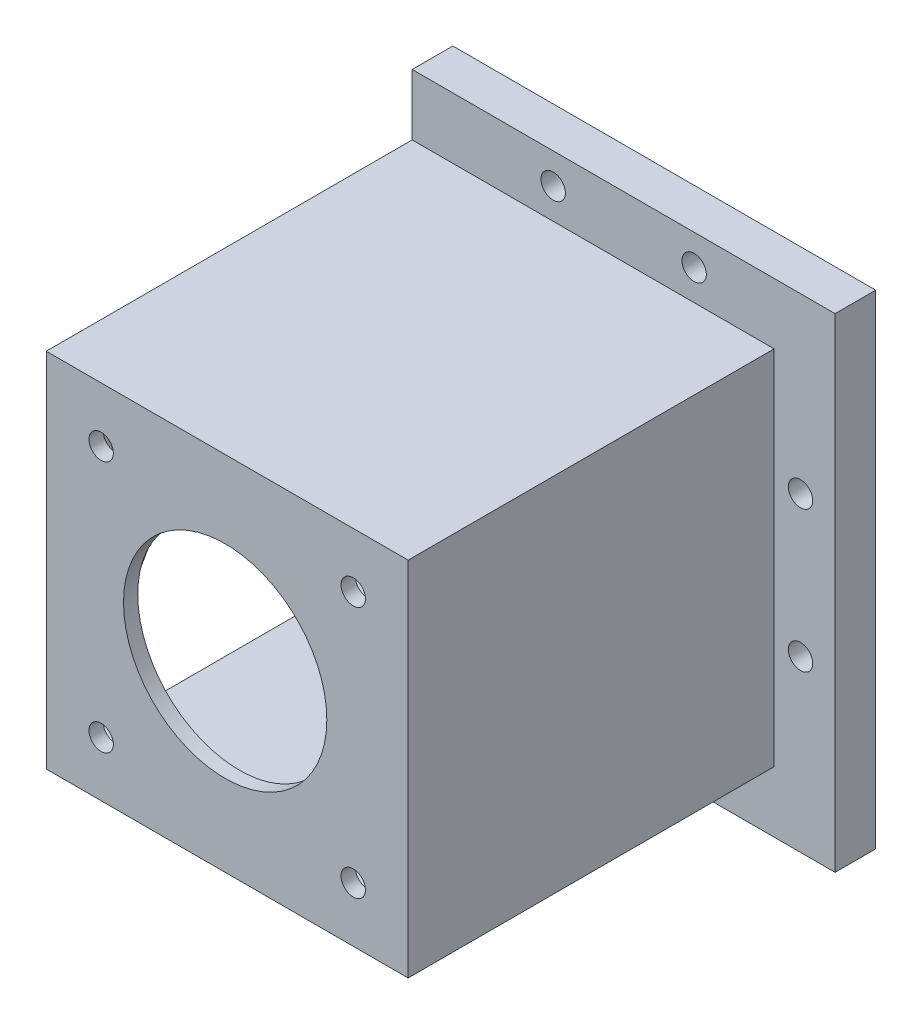
ISO-10303-21;
HEADER;
FILE_DESCRIPTION(('STEP AP214'),'2;1');
FILE_NAME('part.step','',(''),(''),'','','');
FILE_SCHEMA(('AUTOMOTIVE_DESIGN { 1 0 10303 214 1 1 1 1 }'));
ENDSEC;
DATA;
#1=APPLICATION_CONTEXT('core data for automotive mechanical design processes');
#2=APPLICATION_PROTOCOL_DEFINITION('international standard','automotive_design',2000,#1);
#3=PRODUCT_CONTEXT('',#1,'mechanical');
#4=PRODUCT('Part','Part','',(#3));
#5=PRODUCT_RELATED_PRODUCT_CATEGORY('part','',(#4));
#6=PRODUCT_DEFINITION_FORMATION('','',#4);
#7=PRODUCT_DEFINITION_CONTEXT('part definition',#1,'design');
#8=PRODUCT_DEFINITION('design','',#6,#7);
#9=PRODUCT_DEFINITION_SHAPE('','',#8);
#10=(LENGTH_UNIT() NAMED_UNIT(*) SI_UNIT(.MILLI.,.METRE.));
#11=(NAMED_UNIT(*) PLANE_ANGLE_UNIT() SI_UNIT($,.RADIAN.));
#12=(NAMED_UNIT(*) SI_UNIT($,.STERADIAN.) SOLID_ANGLE_UNIT());
#13=UNCERTAINTY_MEASURE_WITH_UNIT(LENGTH_MEASURE(1.E-05),#10,'distance_accuracy_value','');
#14=(GEOMETRIC_REPRESENTATION_CONTEXT(3) GLOBAL_UNCERTAINTY_ASSIGNED_CONTEXT((#13)) GLOBAL_UNIT_ASSIGNED_CONTEXT((#10,
#11,#12)) REPRESENTATION_CONTEXT('',''));
#15=CARTESIAN_POINT('',(0.,0.,0.));
#16=DIRECTION('',(0.,0.,1.));
#17=DIRECTION('',(1.,0.,0.));
#18=AXIS2_PLACEMENT_3D('',#15,#16,#17);
#19=CARTESIAN_POINT('',(-482.021213625064,0.,5.));
#20=DIRECTION('',(1.,0.,0.));
#21=DIRECTION('',(0.,0.,-1.));
#22=AXIS2_PLACEMENT_3D('',#19,#20,#21);
#23=PLANE('',#22);
#24=DIRECTION('',(0.,0.,-1.));
#25=VECTOR('',#24,1.);
#26=CARTESIAN_POINT('',(-482.021213625064,-181.581134846924,48.25));
#27=LINE('',#26,#25);
#28=CARTESIAN_POINT('',(-482.021213625064,-181.581134846924,24.125));
#29=VERTEX_POINT('',#28);
#30=CARTESIAN_POINT('',(-482.021213625064,-181.581134846924,0.));
#31=VERTEX_POINT('',#30);
#32=EDGE_CURVE('E55',#29,#31,#27,.T.);
#33=ORIENTED_EDGE('',*,*,#32,.F.);
#34=DIRECTION('',(0.,-0.869656237387225,0.493657805340395));
#35=VECTOR('',#34,1.);
#36=CARTESIAN_POINT('',(-482.021213625064,-181.581134846924,24.125));
#37=LINE('',#36,#35);
#38=CARTESIAN_POINT('',(-482.021213625064,-224.081134846924,48.25));
#39=VERTEX_POINT('',#38);
#40=EDGE_CURVE('E365',#29,#39,#37,.T.);
#41=ORIENTED_EDGE('',*,*,#40,.T.);
#42=DIRECTION('',(0.,0.,-1.));
#43=VECTOR('',#42,1.);
#44=CARTESIAN_POINT('',(-482.021213625064,-224.081134846924,48.25));
#45=LINE('',#44,#43);
#46=CARTESIAN_POINT('',(-482.021213625064,-224.081134846924,0.));
#47=VERTEX_POINT('',#46);
#48=EDGE_CURVE('E399',#39,#47,#45,.T.);
#49=ORIENTED_EDGE('',*,*,#48,.T.);
#50=DIRECTION('',(0.,-1.,0.));
#51=VECTOR('',#50,1.);
#52=CARTESIAN_POINT('',(-482.021213625064,0.,0.));
#53=LINE('',#52,#51);
#54=CARTESIAN_POINT('',(-482.021213625064,-232.581134846924,0.));
#55=VERTEX_POINT('',#54);
#56=EDGE_CURVE('E190',#47,#55,#53,.T.);
#57=ORIENTED_EDGE('',*,*,#56,.T.);
#58=DIRECTION('',(0.,0.,-1.));
#59=VECTOR('',#58,1.);
#60=CARTESIAN_POINT('',(-482.021213625064,-232.581134846924,5.));
#61=LINE('',#60,#59);
#62=CARTESIAN_POINT('',(-482.021213625064,-232.581134846924,5.));
#63=VERTEX_POINT('',#62);
#64=EDGE_CURVE('E11',#63,#55,#61,.T.);
#65=ORIENTED_EDGE('',*,*,#64,.F.);
#66=DIRECTION('',(0.,-1.,0.));
#67=VECTOR('',#66,1.);
#68=CARTESIAN_POINT('',(-482.021213625064,0.,5.));
#69=LINE('',#68,#67);
#70=CARTESIAN_POINT('',(-482.021213625064,-225.081134846924,5.));
#71=VERTEX_POINT('',#70);
#72=EDGE_CURVE('E64',#71,#63,#69,.T.);
#73=ORIENTED_EDGE('',*,*,#72,.F.);
#74=DIRECTION('',(0.,0.,-1.));
#75=VECTOR('',#74,1.);
#76=CARTESIAN_POINT('',(-482.021213625064,-225.081134846924,50.));
#77=LINE('',#76,#75);
#78=CARTESIAN_POINT('',(-482.021213625064,-225.081134846924,50.));
#79=VERTEX_POINT('',#78);
#80=EDGE_CURVE('E140',#79,#71,#77,.T.);
#81=ORIENTED_EDGE('',*,*,#80,.F.);
#82=DIRECTION('',(0.,1.,0.));
#83=VECTOR('',#82,1.);
#84=CARTESIAN_POINT('',(-482.021213625064,0.,50.));
#85=LINE('',#84,#83);
#86=CARTESIAN_POINT('',(-482.021213625064,-180.581134846924,50.));
#87=VERTEX_POINT('',#86);
#88=EDGE_CURVE('E435',#79,#87,#85,.T.);
#89=ORIENTED_EDGE('',*,*,#88,.T.);
#90=DIRECTION('',(0.,0.,-1.));
#91=VECTOR('',#90,1.);
#92=CARTESIAN_POINT('',(-482.021213625064,-180.581134846924,50.));
#93=LINE('',#92,#91);
#94=CARTESIAN_POINT('',(-482.021213625064,-180.581134846924,5.));
#95=VERTEX_POINT('',#94);
#96=EDGE_CURVE('E136',#87,#95,#93,.T.);
#97=ORIENTED_EDGE('',*,*,#96,.T.);
#98=CARTESIAN_POINT('',(-482.021213625064,-173.081134846924,5.));
#99=VERTEX_POINT('',#98);
#100=EDGE_CURVE('E115',#99,#95,#69,.T.);
#101=ORIENTED_EDGE('',*,*,#100,.F.);
#102=DIRECTION('',(0.,0.,-1.));
#103=VECTOR('',#102,1.);
#104=CARTESIAN_POINT('',(-482.021213625064,-173.081134846924,5.));
#105=LINE('',#104,#103);
#106=CARTESIAN_POINT('',(-482.021213625064,-173.081134846924,0.));
#107=VERTEX_POINT('',#106);
#108=EDGE_CURVE('E86',#99,#107,#105,.T.);
#109=ORIENTED_EDGE('',*,*,#108,.T.);
#110=EDGE_CURVE('E148',#107,#31,#53,.T.);
#111=ORIENTED_EDGE('',*,*,#110,.T.);
#112=EDGE_LOOP('',(#33,#41,#49,#57,#65,#73,#81,#89,#97,#101,#109,#111));
#113=FACE_BOUND('',#112,.T.);
#114=ADVANCED_FACE('F39',(#113),#23,.F.);
#115=CARTESIAN_POINT('',(0.,0.,0.));
#116=DIRECTION('',(0.,0.,1.));
#117=DIRECTION('',(1.,0.,0.));
#118=AXIS2_PLACEMENT_3D('',#115,#116,#117);
#119=PLANE('',#118);
#120=CARTESIAN_POINT('',(-464.687880625064,-228.331134846924,0.));
#121=DIRECTION('',(0.,0.,1.));
#122=DIRECTION('',(1.,0.,0.));
#123=AXIS2_PLACEMENT_3D('',#120,#121,#122);
#124=CIRCLE('',#123,1.50000000000002);
#125=CARTESIAN_POINT('',(-463.187880625064,-228.331134846924,0.));
#126=VERTEX_POINT('',#125);
#127=EDGE_CURVE('E185',#126,#126,#124,.T.);
#128=ORIENTED_EDGE('',*,*,#127,.T.);
#129=EDGE_LOOP('',(#128));
#130=FACE_BOUND('',#129,.T.);
#131=CARTESIAN_POINT('',(-447.354547625064,-228.331134846924,0.));
#132=DIRECTION('',(0.,0.,1.));
#133=DIRECTION('',(1.,0.,0.));
#134=AXIS2_PLACEMENT_3D('',#131,#132,#133);
#135=CIRCLE('',#134,1.50000000000002);
#136=CARTESIAN_POINT('',(-445.854547625064,-228.331134846924,0.));
#137=VERTEX_POINT('',#136);
#138=EDGE_CURVE('E182',#137,#137,#135,.T.);
#139=ORIENTED_EDGE('',*,*,#138,.T.);
#140=EDGE_LOOP('',(#139));
#141=FACE_BOUND('',#140,.T.);
#142=CARTESIAN_POINT('',(-447.354550625064,-176.831134846924,0.));
#143=DIRECTION('',(0.,0.,1.));
#144=DIRECTION('',(1.,0.,0.));
#145=AXIS2_PLACEMENT_3D('',#142,#143,#144);
#146=CIRCLE('',#145,1.50000000000002);
#147=CARTESIAN_POINT('',(-445.854550625064,-176.831134846924,0.));
#148=VERTEX_POINT('',#147);
#149=EDGE_CURVE('E179',#148,#148,#146,.T.);
#150=ORIENTED_EDGE('',*,*,#149,.T.);
#151=EDGE_LOOP('',(#150));
#152=FACE_BOUND('',#151,.T.);
#153=CARTESIAN_POINT('',(-464.687883625064,-176.831134846924,0.));
#154=DIRECTION('',(0.,0.,1.));
#155=DIRECTION('',(1.,0.,0.));
#156=AXIS2_PLACEMENT_3D('',#153,#154,#155);
#157=CIRCLE('',#156,1.50000000000002);
#158=CARTESIAN_POINT('',(-463.187883625064,-176.831134846924,0.));
#159=VERTEX_POINT('',#158);
#160=EDGE_CURVE('E176',#159,#159,#157,.T.);
#161=ORIENTED_EDGE('',*,*,#160,.T.);
#162=EDGE_LOOP('',(#161));
#163=FACE_BOUND('',#162,.T.);
#164=CARTESIAN_POINT('',(-434.271213625064,-211.715651860931,0.));
#165=DIRECTION('',(0.,0.,1.));
#166=DIRECTION('',(1.,0.,0.));
#167=AXIS2_PLACEMENT_3D('',#164,#165,#166);
#168=CIRCLE('',#167,1.50000000000002);
#169=CARTESIAN_POINT('',(-432.771213625064,-211.715651860931,0.));
#170=VERTEX_POINT('',#169);
#171=EDGE_CURVE('E173',#170,#170,#168,.T.);
#172=ORIENTED_EDGE('',*,*,#171,.T.);
#173=EDGE_LOOP('',(#172));
#174=FACE_BOUND('',#173,.T.);
#175=CARTESIAN_POINT('',(-434.271213625064,-194.382318860931,0.));
#176=DIRECTION('',(0.,0.,1.));
#177=DIRECTION('',(1.,0.,0.));
#178=AXIS2_PLACEMENT_3D('',#175,#176,#177);
#179=CIRCLE('',#178,1.50000000000002);
#180=CARTESIAN_POINT('',(-432.771213625064,-194.382318860931,0.));
#181=VERTEX_POINT('',#180);
#182=EDGE_CURVE('E138',#181,#181,#179,.T.);
#183=ORIENTED_EDGE('',*,*,#182,.T.);
#184=EDGE_LOOP('',(#183));
#185=FACE_BOUND('',#184,.T.);
#186=DIRECTION('',(1.,0.,0.));
#187=VECTOR('',#186,1.);
#188=CARTESIAN_POINT('',(-482.021213625064,-224.081134846924,0.));
#189=LINE('',#188,#187);
#190=CARTESIAN_POINT('',(-438.521213625064,-224.081134846924,0.));
#191=VERTEX_POINT('',#190);
#192=EDGE_CURVE('E388',#47,#191,#189,.T.);
#193=ORIENTED_EDGE('',*,*,#192,.T.);
#194=DIRECTION('',(0.,1.,0.));
#195=VECTOR('',#194,1.);
#196=CARTESIAN_POINT('',(-438.521213625064,-224.081134846924,0.));
#197=LINE('',#196,#195);
#198=CARTESIAN_POINT('',(-438.521213625064,-181.581134846924,0.));
#199=VERTEX_POINT('',#198);
#200=EDGE_CURVE('E390',#191,#199,#197,.T.);
#201=ORIENTED_EDGE('',*,*,#200,.T.);
#202=DIRECTION('',(-1.,0.,0.));
#203=VECTOR('',#202,1.);
#204=CARTESIAN_POINT('',(-482.021213625064,-181.581134846924,0.));
#205=LINE('',#204,#203);
#206=EDGE_CURVE('E393',#199,#31,#205,.T.);
#207=ORIENTED_EDGE('',*,*,#206,.T.);
#208=ORIENTED_EDGE('',*,*,#110,.F.);
#209=DIRECTION('',(1.,0.,0.));
#210=VECTOR('',#209,1.);
#211=CARTESIAN_POINT('',(0.,-173.081134846924,0.));
#212=LINE('',#211,#210);
#213=CARTESIAN_POINT('',(-430.021213625064,-173.081134846924,0.));
#214=VERTEX_POINT('',#213);
#215=EDGE_CURVE('E195',#107,#214,#212,.T.);
#216=ORIENTED_EDGE('',*,*,#215,.T.);
#217=DIRECTION('',(0.,1.,0.));
#218=VECTOR('',#217,1.);
#219=CARTESIAN_POINT('',(-430.021213625064,0.,0.));
#220=LINE('',#219,#218);
#221=CARTESIAN_POINT('',(-430.021213625064,-232.581134846924,0.));
#222=VERTEX_POINT('',#221);
#223=EDGE_CURVE('E192',#222,#214,#220,.T.);
#224=ORIENTED_EDGE('',*,*,#223,.F.);
#225=DIRECTION('',(1.,0.,0.));
#226=VECTOR('',#225,1.);
#227=CARTESIAN_POINT('',(0.,-232.581134846924,0.));
#228=LINE('',#227,#226);
#229=EDGE_CURVE('E188',#55,#222,#228,.T.);
#230=ORIENTED_EDGE('',*,*,#229,.F.);
#231=ORIENTED_EDGE('',*,*,#56,.F.);
#232=EDGE_LOOP('',(#193,#201,#207,#208,#216,#224,#230,#231));
#233=FACE_BOUND('',#232,.T.);
#234=ADVANCED_FACE('F210',(#130,#141,#152,#163,#174,#185,#233),#119,.F.);
#235=CARTESIAN_POINT('',(-460.021213625064,-202.581134846924,50.));
#236=DIRECTION('',(0.,0.,-1.));
#237=DIRECTION('',(-1.,0.,0.));
#238=AXIS2_PLACEMENT_3D('',#235,#236,#237);
#239=CYLINDRICAL_SURFACE('',#238,12.5);
#240=CARTESIAN_POINT('',(-460.021213625064,-202.581134846924,50.));
#241=DIRECTION('',(0.,0.,1.));
#242=DIRECTION('',(1.,0.,0.));
#243=AXIS2_PLACEMENT_3D('',#240,#241,#242);
#244=CIRCLE('',#243,12.5);
#245=CARTESIAN_POINT('',(-447.521213625064,-202.581134846924,50.));
#246=VERTEX_POINT('',#245);
#247=EDGE_CURVE('E425',#246,#246,#244,.T.);
#248=ORIENTED_EDGE('',*,*,#247,.T.);
#249=EDGE_LOOP('',(#248));
#250=FACE_BOUND('',#249,.T.);
#251=CARTESIAN_POINT('',(-460.021213625064,-202.581134846924,48.25));
#252=DIRECTION('',(0.,0.,-1.));
#253=DIRECTION('',(-1.,0.,0.));
#254=AXIS2_PLACEMENT_3D('',#251,#252,#253);
#255=CIRCLE('',#254,12.5);
#256=CARTESIAN_POINT('',(-472.521213625064,-202.581134846924,48.25));
#257=VERTEX_POINT('',#256);
#258=EDGE_CURVE('E410',#257,#257,#255,.T.);
#259=ORIENTED_EDGE('',*,*,#258,.T.);
#260=EDGE_LOOP('',(#259));
#261=FACE_BOUND('',#260,.T.);
#262=ADVANCED_FACE('F235',(#250,#261),#239,.F.);
#263=CARTESIAN_POINT('',(-475.271213625064,-187.331134846924,50.));
#264=DIRECTION('',(0.,0.,-1.));
#265=DIRECTION('',(-1.,0.,0.));
#266=AXIS2_PLACEMENT_3D('',#263,#264,#265);
#267=CYLINDRICAL_SURFACE('',#266,1.50000000000002);
#268=CARTESIAN_POINT('',(-475.271213625064,-187.331134846924,50.));
#269=DIRECTION('',(0.,0.,1.));
#270=DIRECTION('',(1.,0.,0.));
#271=AXIS2_PLACEMENT_3D('',#268,#269,#270);
#272=CIRCLE('',#271,1.50000000000002);
#273=CARTESIAN_POINT('',(-473.771213625064,-187.331134846924,50.));
#274=VERTEX_POINT('',#273);
#275=EDGE_CURVE('E422',#274,#274,#272,.T.);
#276=ORIENTED_EDGE('',*,*,#275,.T.);
#277=EDGE_LOOP('',(#276));
#278=FACE_BOUND('',#277,.T.);
#279=CARTESIAN_POINT('',(-475.271213625064,-187.331134846924,48.25));
#280=DIRECTION('',(0.,0.,-1.));
#281=DIRECTION('',(-1.,0.,0.));
#282=AXIS2_PLACEMENT_3D('',#279,#280,#281);
#283=CIRCLE('',#282,1.50000000000002);
#284=CARTESIAN_POINT('',(-476.771213625064,-187.331134846924,48.25));
#285=VERTEX_POINT('',#284);
#286=EDGE_CURVE('E407',#285,#285,#283,.T.);
#287=ORIENTED_EDGE('',*,*,#286,.T.);
#288=EDGE_LOOP('',(#287));
#289=FACE_BOUND('',#288,.T.);
#290=ADVANCED_FACE('F309',(#278,#289),#267,.F.);
#291=CARTESIAN_POINT('',(-444.271213625064,-187.331134846924,50.));
#292=DIRECTION('',(0.,0.,-1.));
#293=DIRECTION('',(-1.,0.,0.));
#294=AXIS2_PLACEMENT_3D('',#291,#292,#293);
#295=CYLINDRICAL_SURFACE('',#294,1.49999999999996);
#296=CARTESIAN_POINT('',(-444.271213625064,-187.331134846924,50.));
#297=DIRECTION('',(0.,0.,1.));
#298=DIRECTION('',(1.,0.,0.));
#299=AXIS2_PLACEMENT_3D('',#296,#297,#298);
#300=CIRCLE('',#299,1.49999999999996);
#301=CARTESIAN_POINT('',(-442.771213625064,-187.331134846924,50.));
#302=VERTEX_POINT('',#301);
#303=EDGE_CURVE('E419',#302,#302,#300,.T.);
#304=ORIENTED_EDGE('',*,*,#303,.T.);
#305=EDGE_LOOP('',(#304));
#306=FACE_BOUND('',#305,.T.);
#307=CARTESIAN_POINT('',(-444.271213625064,-187.331134846924,48.25));
#308=DIRECTION('',(0.,0.,-1.));
#309=DIRECTION('',(-1.,0.,0.));
#310=AXIS2_PLACEMENT_3D('',#307,#308,#309);
#311=CIRCLE('',#310,1.49999999999996);
#312=CARTESIAN_POINT('',(-445.771213625064,-187.331134846924,48.25));
#313=VERTEX_POINT('',#312);
#314=EDGE_CURVE('E404',#313,#313,#311,.T.);
#315=ORIENTED_EDGE('',*,*,#314,.T.);
#316=EDGE_LOOP('',(#315));
#317=FACE_BOUND('',#316,.T.);
#318=ADVANCED_FACE('F305',(#306,#317),#295,.F.);
#319=CARTESIAN_POINT('',(-444.271213625063,-218.331134846924,50.));
#320=DIRECTION('',(0.,0.,-1.));
#321=DIRECTION('',(-1.,0.,0.));
#322=AXIS2_PLACEMENT_3D('',#319,#320,#321);
#323=CYLINDRICAL_SURFACE('',#322,1.50000000000002);
#324=CARTESIAN_POINT('',(-444.271213625063,-218.331134846924,50.));
#325=DIRECTION('',(0.,0.,1.));
#326=DIRECTION('',(1.,0.,0.));
#327=AXIS2_PLACEMENT_3D('',#324,#325,#326);
#328=CIRCLE('',#327,1.50000000000002);
#329=CARTESIAN_POINT('',(-442.771213625063,-218.331134846924,50.));
#330=VERTEX_POINT('',#329);
#331=EDGE_CURVE('E416',#330,#330,#328,.T.);
#332=ORIENTED_EDGE('',*,*,#331,.T.);
#333=EDGE_LOOP('',(#332));
#334=FACE_BOUND('',#333,.T.);
#335=CARTESIAN_POINT('',(-444.271213625063,-218.331134846924,48.25));
#336=DIRECTION('',(0.,0.,-1.));
#337=DIRECTION('',(-1.,0.,0.));
#338=AXIS2_PLACEMENT_3D('',#335,#336,#337);
#339=CIRCLE('',#338,1.50000000000002);
#340=CARTESIAN_POINT('',(-445.771213625063,-218.331134846924,48.25));
#341=VERTEX_POINT('',#340);
#342=EDGE_CURVE('E401',#341,#341,#339,.T.);
#343=ORIENTED_EDGE('',*,*,#342,.T.);
#344=EDGE_LOOP('',(#343));
#345=FACE_BOUND('',#344,.T.);
#346=ADVANCED_FACE('F226',(#334,#345),#323,.F.);
#347=CARTESIAN_POINT('',(-475.271213625063,-218.331134846924,50.));
#348=DIRECTION('',(0.,0.,-1.));
#349=DIRECTION('',(-1.,0.,0.));
#350=AXIS2_PLACEMENT_3D('',#347,#348,#349);
#351=CYLINDRICAL_SURFACE('',#350,1.50000000000002);
#352=CARTESIAN_POINT('',(-475.271213625063,-218.331134846924,50.));
#353=DIRECTION('',(0.,0.,1.));
#354=DIRECTION('',(1.,0.,0.));
#355=AXIS2_PLACEMENT_3D('',#352,#353,#354);
#356=CIRCLE('',#355,1.50000000000002);
#357=CARTESIAN_POINT('',(-473.771213625063,-218.331134846924,50.));
#358=VERTEX_POINT('',#357);
#359=EDGE_CURVE('E413',#358,#358,#356,.T.);
#360=ORIENTED_EDGE('',*,*,#359,.T.);
#361=EDGE_LOOP('',(#360));
#362=FACE_BOUND('',#361,.T.);
#363=CARTESIAN_POINT('',(-475.271213625063,-218.331134846924,48.25));
#364=DIRECTION('',(0.,0.,-1.));
#365=DIRECTION('',(-1.,0.,0.));
#366=AXIS2_PLACEMENT_3D('',#363,#364,#365);
#367=CIRCLE('',#366,1.50000000000002);
#368=CARTESIAN_POINT('',(-476.771213625063,-218.331134846924,48.25));
#369=VERTEX_POINT('',#368);
#370=EDGE_CURVE('E43',#369,#369,#367,.T.);
#371=ORIENTED_EDGE('',*,*,#370,.T.);
#372=EDGE_LOOP('',(#371));
#373=FACE_BOUND('',#372,.T.);
#374=ADVANCED_FACE('F219',(#362,#373),#351,.F.);
#375=CARTESIAN_POINT('',(0.,-232.581134846924,5.));
#376=DIRECTION('',(0.,1.,0.));
#377=DIRECTION('',(0.,0.,1.));
#378=AXIS2_PLACEMENT_3D('',#375,#376,#377);
#379=PLANE('',#378);
#380=ORIENTED_EDGE('',*,*,#229,.T.);
#381=DIRECTION('',(0.,0.,-1.));
#382=VECTOR('',#381,1.);
#383=CARTESIAN_POINT('',(-430.021213625064,-232.581134846924,5.));
#384=LINE('',#383,#382);
#385=CARTESIAN_POINT('',(-430.021213625064,-232.581134846924,5.));
#386=VERTEX_POINT('',#385);
#387=EDGE_CURVE('E48',#386,#222,#384,.T.);
#388=ORIENTED_EDGE('',*,*,#387,.F.);
#389=DIRECTION('',(1.,0.,0.));
#390=VECTOR('',#389,1.);
#391=CARTESIAN_POINT('',(0.,-232.581134846924,5.));
#392=LINE('',#391,#390);
#393=EDGE_CURVE('E94',#63,#386,#392,.T.);
#394=ORIENTED_EDGE('',*,*,#393,.F.);
#395=ORIENTED_EDGE('',*,*,#64,.T.);
#396=EDGE_LOOP('',(#380,#388,#394,#395));
#397=FACE_BOUND('',#396,.T.);
#398=ADVANCED_FACE('F217',(#397),#379,.F.);
#399=CARTESIAN_POINT('',(-430.021213625064,0.,5.));
#400=DIRECTION('',(-1.,0.,0.));
#401=DIRECTION('',(0.,0.,1.));
#402=AXIS2_PLACEMENT_3D('',#399,#400,#401);
#403=PLANE('',#402);
#404=ORIENTED_EDGE('',*,*,#223,.T.);
#405=DIRECTION('',(0.,0.,-1.));
#406=VECTOR('',#405,1.);
#407=CARTESIAN_POINT('',(-430.021213625064,-173.081134846924,5.));
#408=LINE('',#407,#406);
#409=CARTESIAN_POINT('',(-430.021213625064,-173.081134846924,5.));
#410=VERTEX_POINT('',#409);
#411=EDGE_CURVE('E199',#410,#214,#408,.T.);
#412=ORIENTED_EDGE('',*,*,#411,.F.);
#413=DIRECTION('',(0.,1.,0.));
#414=VECTOR('',#413,1.);
#415=CARTESIAN_POINT('',(-430.021213625064,0.,5.));
#416=LINE('',#415,#414);
#417=EDGE_CURVE('E165',#386,#410,#416,.T.);
#418=ORIENTED_EDGE('',*,*,#417,.F.);
#419=ORIENTED_EDGE('',*,*,#387,.T.);
#420=EDGE_LOOP('',(#404,#412,#418,#419));
#421=FACE_BOUND('',#420,.T.);
#422=ADVANCED_FACE('F205',(#421),#403,.F.);
#423=CARTESIAN_POINT('',(0.,-173.081134846924,5.));
#424=DIRECTION('',(0.,1.,0.));
#425=DIRECTION('',(0.,0.,1.));
#426=AXIS2_PLACEMENT_3D('',#423,#424,#425);
#427=PLANE('',#426);
#428=ORIENTED_EDGE('',*,*,#215,.F.);
#429=ORIENTED_EDGE('',*,*,#108,.F.);
#430=DIRECTION('',(1.,0.,0.));
#431=VECTOR('',#430,1.);
#432=CARTESIAN_POINT('',(0.,-173.081134846924,5.));
#433=LINE('',#432,#431);
#434=EDGE_CURVE('E167',#99,#410,#433,.T.);
#435=ORIENTED_EDGE('',*,*,#434,.T.);
#436=ORIENTED_EDGE('',*,*,#411,.T.);
#437=EDGE_LOOP('',(#428,#429,#435,#436));
#438=FACE_BOUND('',#437,.T.);
#439=ADVANCED_FACE('F214',(#438),#427,.T.);
#440=CARTESIAN_POINT('',(-464.687880625064,-228.331134846924,5.));
#441=DIRECTION('',(0.,0.,-1.));
#442=DIRECTION('',(-1.,0.,0.));
#443=AXIS2_PLACEMENT_3D('',#440,#441,#442);
#444=CYLINDRICAL_SURFACE('',#443,1.50000000000002);
#445=CARTESIAN_POINT('',(-464.687880625064,-228.331134846924,5.));
#446=DIRECTION('',(0.,0.,1.));
#447=DIRECTION('',(1.,0.,0.));
#448=AXIS2_PLACEMENT_3D('',#445,#446,#447);
#449=CIRCLE('',#448,1.50000000000002);
#450=CARTESIAN_POINT('',(-463.187880625064,-228.331134846924,5.));
#451=VERTEX_POINT('',#450);
#452=EDGE_CURVE('E160',#451,#451,#449,.T.);
#453=ORIENTED_EDGE('',*,*,#452,.T.);
#454=EDGE_LOOP('',(#453));
#455=FACE_BOUND('',#454,.T.);
#456=ORIENTED_EDGE('',*,*,#127,.F.);
#457=EDGE_LOOP('',(#456));
#458=FACE_BOUND('',#457,.T.);
#459=ADVANCED_FACE('F241',(#455,#458),#444,.F.);
#460=CARTESIAN_POINT('',(-447.354547625064,-228.331134846924,5.));
#461=DIRECTION('',(0.,0.,-1.));
#462=DIRECTION('',(-1.,0.,0.));
#463=AXIS2_PLACEMENT_3D('',#460,#461,#462);
#464=CYLINDRICAL_SURFACE('',#463,1.50000000000002);
#465=CARTESIAN_POINT('',(-447.354547625064,-228.331134846924,5.));
#466=DIRECTION('',(0.,0.,1.));
#467=DIRECTION('',(1.,0.,0.));
#468=AXIS2_PLACEMENT_3D('',#465,#466,#467);
#469=CIRCLE('',#468,1.50000000000002);
#470=CARTESIAN_POINT('',(-445.854547625064,-228.331134846924,5.));
#471=VERTEX_POINT('',#470);
#472=EDGE_CURVE('E157',#471,#471,#469,.T.);
#473=ORIENTED_EDGE('',*,*,#472,.T.);
#474=EDGE_LOOP('',(#473));
#475=FACE_BOUND('',#474,.T.);
#476=ORIENTED_EDGE('',*,*,#138,.F.);
#477=EDGE_LOOP('',(#476));
#478=FACE_BOUND('',#477,.T.);
#479=ADVANCED_FACE('F245',(#475,#478),#464,.F.);
#480=CARTESIAN_POINT('',(-447.354550625064,-176.831134846924,5.));
#481=DIRECTION('',(0.,0.,-1.));
#482=DIRECTION('',(-1.,0.,0.));
#483=AXIS2_PLACEMENT_3D('',#480,#481,#482);
#484=CYLINDRICAL_SURFACE('',#483,1.50000000000002);
#485=CARTESIAN_POINT('',(-447.354550625064,-176.831134846924,5.));
#486=DIRECTION('',(0.,0.,1.));
#487=DIRECTION('',(1.,0.,0.));
#488=AXIS2_PLACEMENT_3D('',#485,#486,#487);
#489=CIRCLE('',#488,1.50000000000002);
#490=CARTESIAN_POINT('',(-445.854550625064,-176.831134846924,5.));
#491=VERTEX_POINT('',#490);
#492=EDGE_CURVE('E154',#491,#491,#489,.T.);
#493=ORIENTED_EDGE('',*,*,#492,.T.);
#494=EDGE_LOOP('',(#493));
#495=FACE_BOUND('',#494,.T.);
#496=ORIENTED_EDGE('',*,*,#149,.F.);
#497=EDGE_LOOP('',(#496));
#498=FACE_BOUND('',#497,.T.);
#499=ADVANCED_FACE('F250',(#495,#498),#484,.F.);
#500=CARTESIAN_POINT('',(-464.687883625064,-176.831134846924,5.));
#501=DIRECTION('',(0.,0.,-1.));
#502=DIRECTION('',(-1.,0.,0.));
#503=AXIS2_PLACEMENT_3D('',#500,#501,#502);
#504=CYLINDRICAL_SURFACE('',#503,1.50000000000002);
#505=CARTESIAN_POINT('',(-464.687883625064,-176.831134846924,5.));
#506=DIRECTION('',(0.,0.,1.));
#507=DIRECTION('',(1.,0.,0.));
#508=AXIS2_PLACEMENT_3D('',#505,#506,#507);
#509=CIRCLE('',#508,1.50000000000002);
#510=CARTESIAN_POINT('',(-463.187883625064,-176.831134846924,5.));
#511=VERTEX_POINT('',#510);
#512=EDGE_CURVE('E151',#511,#511,#509,.T.);
#513=ORIENTED_EDGE('',*,*,#512,.T.);
#514=EDGE_LOOP('',(#513));
#515=FACE_BOUND('',#514,.T.);
#516=ORIENTED_EDGE('',*,*,#160,.F.);
#517=EDGE_LOOP('',(#516));
#518=FACE_BOUND('',#517,.T.);
#519=ADVANCED_FACE('F257',(#515,#518),#504,.F.);
#520=CARTESIAN_POINT('',(-434.271213625064,-211.715651860931,5.));
#521=DIRECTION('',(0.,0.,-1.));
#522=DIRECTION('',(-1.,0.,0.));
#523=AXIS2_PLACEMENT_3D('',#520,#521,#522);
#524=CYLINDRICAL_SURFACE('',#523,1.50000000000002);
#525=CARTESIAN_POINT('',(-434.271213625064,-211.715651860931,5.));
#526=DIRECTION('',(0.,0.,1.));
#527=DIRECTION('',(1.,0.,0.));
#528=AXIS2_PLACEMENT_3D('',#525,#526,#527);
#529=CIRCLE('',#528,1.50000000000002);
#530=CARTESIAN_POINT('',(-432.771213625064,-211.715651860931,5.));
#531=VERTEX_POINT('',#530);
#532=EDGE_CURVE('E147',#531,#531,#529,.T.);
#533=ORIENTED_EDGE('',*,*,#532,.T.);
#534=EDGE_LOOP('',(#533));
#535=FACE_BOUND('',#534,.T.);
#536=ORIENTED_EDGE('',*,*,#171,.F.);
#537=EDGE_LOOP('',(#536));
#538=FACE_BOUND('',#537,.T.);
#539=ADVANCED_FACE('F260',(#535,#538),#524,.F.);
#540=CARTESIAN_POINT('',(-434.271213625064,-194.382318860931,5.));
#541=DIRECTION('',(0.,0.,-1.));
#542=DIRECTION('',(-1.,0.,0.));
#543=AXIS2_PLACEMENT_3D('',#540,#541,#542);
#544=CYLINDRICAL_SURFACE('',#543,1.50000000000002);
#545=CARTESIAN_POINT('',(-434.271213625064,-194.382318860931,5.));
#546=DIRECTION('',(0.,0.,1.));
#547=DIRECTION('',(1.,0.,0.));
#548=AXIS2_PLACEMENT_3D('',#545,#546,#547);
#549=CIRCLE('',#548,1.50000000000002);
#550=CARTESIAN_POINT('',(-432.771213625064,-194.382318860931,5.));
#551=VERTEX_POINT('',#550);
#552=EDGE_CURVE('E144',#551,#551,#549,.T.);
#553=ORIENTED_EDGE('',*,*,#552,.T.);
#554=EDGE_LOOP('',(#553));
#555=FACE_BOUND('',#554,.T.);
#556=ORIENTED_EDGE('',*,*,#182,.F.);
#557=EDGE_LOOP('',(#556));
#558=FACE_BOUND('',#557,.T.);
#559=ADVANCED_FACE('F41',(#555,#558),#544,.F.);
#560=CARTESIAN_POINT('',(0.,0.,5.));
#561=DIRECTION('',(0.,0.,1.));
#562=DIRECTION('',(1.,0.,0.));
#563=AXIS2_PLACEMENT_3D('',#560,#561,#562);
#564=PLANE('',#563);
#565=ORIENTED_EDGE('',*,*,#552,.F.);
#566=EDGE_LOOP('',(#565));
#567=FACE_BOUND('',#566,.T.);
#568=ORIENTED_EDGE('',*,*,#532,.F.);
#569=EDGE_LOOP('',(#568));
#570=FACE_BOUND('',#569,.T.);
#571=ORIENTED_EDGE('',*,*,#512,.F.);
#572=EDGE_LOOP('',(#571));
#573=FACE_BOUND('',#572,.T.);
#574=ORIENTED_EDGE('',*,*,#492,.F.);
#575=EDGE_LOOP('',(#574));
#576=FACE_BOUND('',#575,.T.);
#577=ORIENTED_EDGE('',*,*,#472,.F.);
#578=EDGE_LOOP('',(#577));
#579=FACE_BOUND('',#578,.T.);
#580=ORIENTED_EDGE('',*,*,#452,.F.);
#581=EDGE_LOOP('',(#580));
#582=FACE_BOUND('',#581,.T.);
#583=ORIENTED_EDGE('',*,*,#72,.T.);
#584=ORIENTED_EDGE('',*,*,#393,.T.);
#585=ORIENTED_EDGE('',*,*,#417,.T.);
#586=ORIENTED_EDGE('',*,*,#434,.F.);
#587=ORIENTED_EDGE('',*,*,#100,.T.);
#588=DIRECTION('',(1.,0.,0.));
#589=VECTOR('',#588,1.);
#590=CARTESIAN_POINT('',(-1.12632209955054E-13,-180.581134846924,5.));
#591=LINE('',#590,#589);
#592=CARTESIAN_POINT('',(-437.521213625064,-180.581134846924,5.));
#593=VERTEX_POINT('',#592);
#594=EDGE_CURVE('E109',#95,#593,#591,.T.);
#595=ORIENTED_EDGE('',*,*,#594,.T.);
#596=DIRECTION('',(0.,1.,0.));
#597=VECTOR('',#596,1.);
#598=CARTESIAN_POINT('',(-437.521213625064,0.,5.));
#599=LINE('',#598,#597);
#600=CARTESIAN_POINT('',(-437.521213625064,-225.081134846924,5.));
#601=VERTEX_POINT('',#600);
#602=EDGE_CURVE('E112',#601,#593,#599,.T.);
#603=ORIENTED_EDGE('',*,*,#602,.F.);
#604=DIRECTION('',(1.,0.,0.));
#605=VECTOR('',#604,1.);
#606=CARTESIAN_POINT('',(0.,-225.081134846924,5.));
#607=LINE('',#606,#605);
#608=EDGE_CURVE('E131',#71,#601,#607,.T.);
#609=ORIENTED_EDGE('',*,*,#608,.F.);
#610=EDGE_LOOP('',(#583,#584,#585,#586,#587,#595,#603,#609));
#611=FACE_BOUND('',#610,.T.);
#612=ADVANCED_FACE('F111',(#567,#570,#573,#576,#579,#582,#611),#564,.T.);
#613=CARTESIAN_POINT('',(0.,-225.081134846924,50.));
#614=DIRECTION('',(0.,1.,0.));
#615=DIRECTION('',(0.,0.,1.));
#616=AXIS2_PLACEMENT_3D('',#613,#614,#615);
#617=PLANE('',#616);
#618=ORIENTED_EDGE('',*,*,#608,.T.);
#619=DIRECTION('',(0.,0.,-1.));
#620=VECTOR('',#619,1.);
#621=CARTESIAN_POINT('',(-437.521213625064,-225.081134846924,50.));
#622=LINE('',#621,#620);
#623=CARTESIAN_POINT('',(-437.521213625064,-225.081134846924,50.));
#624=VERTEX_POINT('',#623);
#625=EDGE_CURVE('E130',#624,#601,#622,.T.);
#626=ORIENTED_EDGE('',*,*,#625,.F.);
#627=DIRECTION('',(1.,0.,0.));
#628=VECTOR('',#627,1.);
#629=CARTESIAN_POINT('',(0.,-225.081134846924,50.));
#630=LINE('',#629,#628);
#631=EDGE_CURVE('E428',#79,#624,#630,.T.);
#632=ORIENTED_EDGE('',*,*,#631,.F.);
#633=ORIENTED_EDGE('',*,*,#80,.T.);
#634=EDGE_LOOP('',(#618,#626,#632,#633));
#635=FACE_BOUND('',#634,.T.);
#636=ADVANCED_FACE('F278',(#635),#617,.F.);
#637=CARTESIAN_POINT('',(-437.521213625064,0.,50.));
#638=DIRECTION('',(-1.,0.,0.));
#639=DIRECTION('',(0.,0.,1.));
#640=AXIS2_PLACEMENT_3D('',#637,#638,#639);
#641=PLANE('',#640);
#642=ORIENTED_EDGE('',*,*,#602,.T.);
#643=DIRECTION('',(0.,0.,-1.));
#644=VECTOR('',#643,1.);
#645=CARTESIAN_POINT('',(-437.521213625064,-180.581134846924,50.));
#646=LINE('',#645,#644);
#647=CARTESIAN_POINT('',(-437.521213625064,-180.581134846924,50.));
#648=VERTEX_POINT('',#647);
#649=EDGE_CURVE('E127',#648,#593,#646,.T.);
#650=ORIENTED_EDGE('',*,*,#649,.F.);
#651=DIRECTION('',(0.,1.,0.));
#652=VECTOR('',#651,1.);
#653=CARTESIAN_POINT('',(-437.521213625064,0.,50.));
#654=LINE('',#653,#652);
#655=EDGE_CURVE('E431',#624,#648,#654,.T.);
#656=ORIENTED_EDGE('',*,*,#655,.F.);
#657=ORIENTED_EDGE('',*,*,#625,.T.);
#658=EDGE_LOOP('',(#642,#650,#656,#657));
#659=FACE_BOUND('',#658,.T.);
#660=ADVANCED_FACE('F124',(#659),#641,.F.);
#661=CARTESIAN_POINT('',(-1.12632209955054E-13,-180.581134846924,50.));
#662=DIRECTION('',(0.,1.,0.));
#663=DIRECTION('',(-1.,0.,0.));
#664=AXIS2_PLACEMENT_3D('',#661,#662,#663);
#665=PLANE('',#664);
#666=ORIENTED_EDGE('',*,*,#649,.T.);
#667=ORIENTED_EDGE('',*,*,#594,.F.);
#668=ORIENTED_EDGE('',*,*,#96,.F.);
#669=DIRECTION('',(1.,0.,0.));
#670=VECTOR('',#669,1.);
#671=CARTESIAN_POINT('',(-1.12632209955054E-13,-180.581134846924,50.));
#672=LINE('',#671,#670);
#673=EDGE_CURVE('E135',#87,#648,#672,.T.);
#674=ORIENTED_EDGE('',*,*,#673,.T.);
#675=EDGE_LOOP('',(#666,#667,#668,#674));
#676=FACE_BOUND('',#675,.T.);
#677=ADVANCED_FACE('F133',(#676),#665,.T.);
#678=CARTESIAN_POINT('',(0.,0.,50.));
#679=DIRECTION('',(0.,0.,1.));
#680=DIRECTION('',(1.,0.,0.));
#681=AXIS2_PLACEMENT_3D('',#678,#679,#680);
#682=PLANE('',#681);
#683=ORIENTED_EDGE('',*,*,#359,.F.);
#684=EDGE_LOOP('',(#683));
#685=FACE_BOUND('',#684,.T.);
#686=ORIENTED_EDGE('',*,*,#331,.F.);
#687=EDGE_LOOP('',(#686));
#688=FACE_BOUND('',#687,.T.);
#689=ORIENTED_EDGE('',*,*,#303,.F.);
#690=EDGE_LOOP('',(#689));
#691=FACE_BOUND('',#690,.T.);
#692=ORIENTED_EDGE('',*,*,#275,.F.);
#693=EDGE_LOOP('',(#692));
#694=FACE_BOUND('',#693,.T.);
#695=ORIENTED_EDGE('',*,*,#247,.F.);
#696=EDGE_LOOP('',(#695));
#697=FACE_BOUND('',#696,.T.);
#698=ORIENTED_EDGE('',*,*,#631,.T.);
#699=ORIENTED_EDGE('',*,*,#655,.T.);
#700=ORIENTED_EDGE('',*,*,#673,.F.);
#701=ORIENTED_EDGE('',*,*,#88,.F.);
#702=EDGE_LOOP('',(#698,#699,#700,#701));
#703=FACE_BOUND('',#702,.T.);
#704=ADVANCED_FACE('F321',(#685,#688,#691,#694,#697,#703),#682,.T.);
#705=CARTESIAN_POINT('',(-482.021213625064,-224.081134846924,48.25));
#706=DIRECTION('',(0.,1.,0.));
#707=DIRECTION('',(0.,0.,1.));
#708=AXIS2_PLACEMENT_3D('',#705,#706,#707);
#709=PLANE('',#708);
#710=ORIENTED_EDGE('',*,*,#192,.F.);
#711=ORIENTED_EDGE('',*,*,#48,.F.);
#712=DIRECTION('',(1.,0.,0.));
#713=VECTOR('',#712,1.);
#714=CARTESIAN_POINT('',(-482.021213625064,-224.081134846924,48.25));
#715=LINE('',#714,#713);
#716=CARTESIAN_POINT('',(-481.021213625064,-224.081134846924,48.25));
#717=VERTEX_POINT('',#716);
#718=EDGE_CURVE('E384',#39,#717,#715,.T.);
#719=ORIENTED_EDGE('',*,*,#718,.T.);
#720=CARTESIAN_POINT('',(-438.521213625064,-224.081134846924,48.25));
#721=VERTEX_POINT('',#720);
#722=EDGE_CURVE('E373',#717,#721,#715,.T.);
#723=ORIENTED_EDGE('',*,*,#722,.T.);
#724=DIRECTION('',(0.,0.,-1.));
#725=VECTOR('',#724,1.);
#726=CARTESIAN_POINT('',(-438.521213625064,-224.081134846924,48.25));
#727=LINE('',#726,#725);
#728=EDGE_CURVE('E396',#721,#191,#727,.T.);
#729=ORIENTED_EDGE('',*,*,#728,.T.);
#730=EDGE_LOOP('',(#710,#711,#719,#723,#729));
#731=FACE_BOUND('',#730,.T.);
#732=ADVANCED_FACE('F324',(#731),#709,.T.);
#733=CARTESIAN_POINT('',(-438.521213625064,-224.081134846924,48.25));
#734=DIRECTION('',(-1.,0.,0.));
#735=DIRECTION('',(0.,0.,1.));
#736=AXIS2_PLACEMENT_3D('',#733,#734,#735);
#737=PLANE('',#736);
#738=ORIENTED_EDGE('',*,*,#200,.F.);
#739=ORIENTED_EDGE('',*,*,#728,.F.);
#740=DIRECTION('',(0.,1.,0.));
#741=VECTOR('',#740,1.);
#742=CARTESIAN_POINT('',(-438.521213625064,-224.081134846924,48.25));
#743=LINE('',#742,#741);
#744=CARTESIAN_POINT('',(-438.521213625064,-181.581134846924,48.25));
#745=VERTEX_POINT('',#744);
#746=EDGE_CURVE('E380',#721,#745,#743,.T.);
#747=ORIENTED_EDGE('',*,*,#746,.T.);
#748=DIRECTION('',(0.,0.,-1.));
#749=VECTOR('',#748,1.);
#750=CARTESIAN_POINT('',(-438.521213625064,-181.581134846924,48.25));
#751=LINE('',#750,#749);
#752=EDGE_CURVE('E379',#745,#199,#751,.T.);
#753=ORIENTED_EDGE('',*,*,#752,.T.);
#754=EDGE_LOOP('',(#738,#739,#747,#753));
#755=FACE_BOUND('',#754,.T.);
#756=ADVANCED_FACE('F328',(#755),#737,.T.);
#757=CARTESIAN_POINT('',(-482.021213625064,-181.581134846924,48.25));
#758=DIRECTION('',(0.,-1.,0.));
#759=DIRECTION('',(0.,0.,-1.));
#760=AXIS2_PLACEMENT_3D('',#757,#758,#759);
#761=PLANE('',#760);
#762=DIRECTION('',(-1.,0.,0.));
#763=VECTOR('',#762,1.);
#764=CARTESIAN_POINT('',(-481.021213625064,-181.581134846924,24.125));
#765=LINE('',#764,#763);
#766=CARTESIAN_POINT('',(-481.021213625064,-181.581134846924,24.125));
#767=VERTEX_POINT('',#766);
#768=EDGE_CURVE('E375',#767,#29,#765,.T.);
#769=ORIENTED_EDGE('',*,*,#768,.T.);
#770=ORIENTED_EDGE('',*,*,#32,.T.);
#771=ORIENTED_EDGE('',*,*,#206,.F.);
#772=ORIENTED_EDGE('',*,*,#752,.F.);
#773=DIRECTION('',(-1.,0.,0.));
#774=VECTOR('',#773,1.);
#775=CARTESIAN_POINT('',(-482.021213625064,-181.581134846924,48.25));
#776=LINE('',#775,#774);
#777=CARTESIAN_POINT('',(-481.021213625064,-181.581134846924,48.25));
#778=VERTEX_POINT('',#777);
#779=EDGE_CURVE('E371',#745,#778,#776,.T.);
#780=ORIENTED_EDGE('',*,*,#779,.T.);
#781=DIRECTION('',(0.,0.,-1.));
#782=VECTOR('',#781,1.);
#783=CARTESIAN_POINT('',(-481.021213625064,-181.581134846924,48.25));
#784=LINE('',#783,#782);
#785=EDGE_CURVE('E354',#778,#767,#784,.T.);
#786=ORIENTED_EDGE('',*,*,#785,.T.);
#787=EDGE_LOOP('',(#769,#770,#771,#772,#780,#786));
#788=FACE_BOUND('',#787,.T.);
#789=ADVANCED_FACE('F332',(#788),#761,.T.);
#790=CARTESIAN_POINT('',(0.,0.,48.25));
#791=DIRECTION('',(0.,0.,-1.));
#792=DIRECTION('',(-1.,0.,0.));
#793=AXIS2_PLACEMENT_3D('',#790,#791,#792);
#794=PLANE('',#793);
#795=DIRECTION('',(0.,1.,0.));
#796=VECTOR('',#795,1.);
#797=CARTESIAN_POINT('',(-481.021213625064,-224.081134846924,48.25));
#798=LINE('',#797,#796);
#799=EDGE_CURVE('E357',#717,#778,#798,.T.);
#800=ORIENTED_EDGE('',*,*,#799,.T.);
#801=ORIENTED_EDGE('',*,*,#779,.F.);
#802=ORIENTED_EDGE('',*,*,#746,.F.);
#803=ORIENTED_EDGE('',*,*,#722,.F.);
#804=EDGE_LOOP('',(#800,#801,#802,#803));
#805=FACE_BOUND('',#804,.T.);
#806=ORIENTED_EDGE('',*,*,#258,.F.);
#807=EDGE_LOOP('',(#806));
#808=FACE_BOUND('',#807,.T.);
#809=ORIENTED_EDGE('',*,*,#286,.F.);
#810=EDGE_LOOP('',(#809));
#811=FACE_BOUND('',#810,.T.);
#812=ORIENTED_EDGE('',*,*,#314,.F.);
#813=EDGE_LOOP('',(#812));
#814=FACE_BOUND('',#813,.T.);
#815=ORIENTED_EDGE('',*,*,#342,.F.);
#816=EDGE_LOOP('',(#815));
#817=FACE_BOUND('',#816,.T.);
#818=ORIENTED_EDGE('',*,*,#370,.F.);
#819=EDGE_LOOP('',(#818));
#820=FACE_BOUND('',#819,.T.);
#821=ADVANCED_FACE('F336',(#805,#808,#811,#814,#817,#820),#794,.T.);
#822=CARTESIAN_POINT('',(-481.021213625064,-181.581134846924,24.125));
#823=DIRECTION('',(0.,-0.493657805340395,-0.869656237387225));
#824=DIRECTION('',(0.,0.869656237387225,-0.493657805340395));
#825=AXIS2_PLACEMENT_3D('',#822,#823,#824);
#826=PLANE('',#825);
#827=ORIENTED_EDGE('',*,*,#40,.F.);
#828=ORIENTED_EDGE('',*,*,#768,.F.);
#829=DIRECTION('',(0.,-0.869656237387225,0.493657805340395));
#830=VECTOR('',#829,1.);
#831=CARTESIAN_POINT('',(-481.021213625064,-181.581134846924,24.125));
#832=LINE('',#831,#830);
#833=EDGE_CURVE('E361',#767,#717,#832,.T.);
#834=ORIENTED_EDGE('',*,*,#833,.T.);
#835=ORIENTED_EDGE('',*,*,#718,.F.);
#836=EDGE_LOOP('',(#827,#828,#834,#835));
#837=FACE_BOUND('',#836,.T.);
#838=ADVANCED_FACE('F339',(#837),#826,.T.);
#839=CARTESIAN_POINT('',(-481.021213625064,0.,0.));
#840=DIRECTION('',(1.,0.,0.));
#841=DIRECTION('',(0.,0.,-1.));
#842=AXIS2_PLACEMENT_3D('',#839,#840,#841);
#843=PLANE('',#842);
#844=ORIENTED_EDGE('',*,*,#785,.F.);
#845=ORIENTED_EDGE('',*,*,#799,.F.);
#846=ORIENTED_EDGE('',*,*,#833,.F.);
#847=EDGE_LOOP('',(#844,#845,#846));
#848=FACE_BOUND('',#847,.T.);
#849=ADVANCED_FACE('F343',(#848),#843,.T.);
#850=CLOSED_SHELL('',(#114,#234,#262,#290,#318,#346,#374,#398,#422,#439,#459,#479,#499,#519,
#539,#559,#612,#636,#660,#677,#704,#732,#756,#789,#821,#838,#849));
#851=MANIFOLD_SOLID_BREP('B2',#850);
#852=ADVANCED_BREP_SHAPE_REPRESENTATION('',(#18,#851),#14);
#853=SHAPE_DEFINITION_REPRESENTATION(#9,#852);
ENDSEC;
END-ISO-10303-21;
